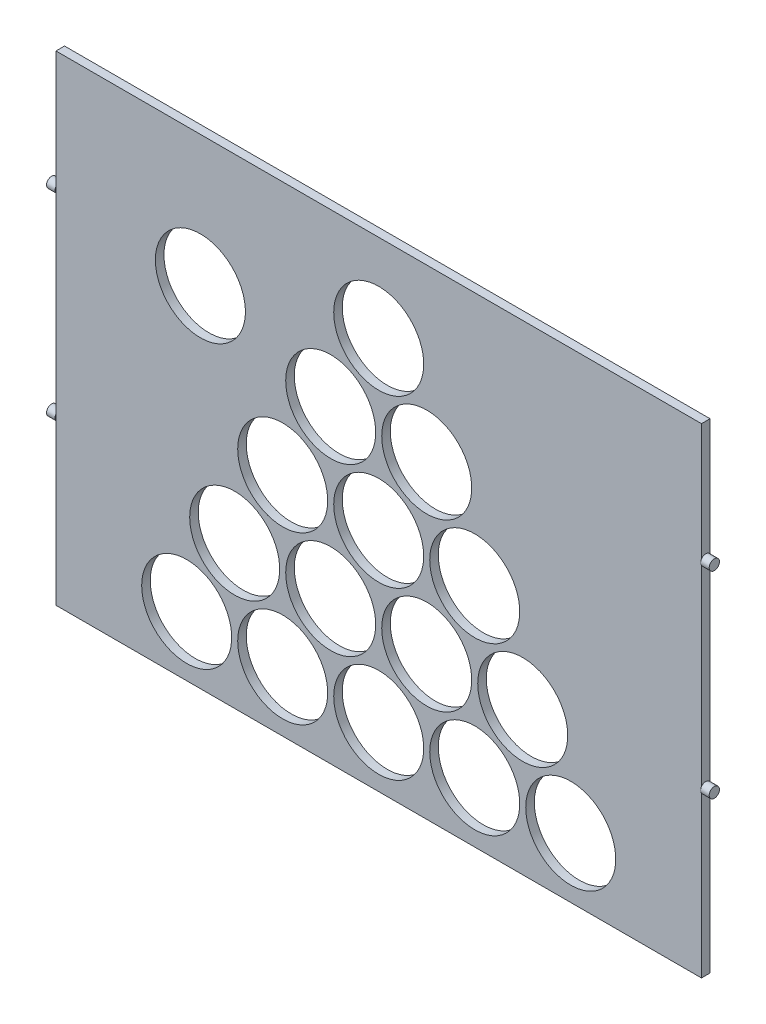
ISO-10303-21;
HEADER;
FILE_DESCRIPTION(('STEP AP214'),'2;1');
FILE_NAME('part.step','',(''),(''),'','','');
FILE_SCHEMA(('AUTOMOTIVE_DESIGN { 1 0 10303 214 1 1 1 1 }'));
ENDSEC;
DATA;
#1=APPLICATION_CONTEXT('core data for automotive mechanical design processes');
#2=APPLICATION_PROTOCOL_DEFINITION('international standard','automotive_design',2000,#1);
#3=PRODUCT_CONTEXT('',#1,'mechanical');
#4=PRODUCT('Part','Part','',(#3));
#5=PRODUCT_RELATED_PRODUCT_CATEGORY('part','',(#4));
#6=PRODUCT_DEFINITION_FORMATION('','',#4);
#7=PRODUCT_DEFINITION_CONTEXT('part definition',#1,'design');
#8=PRODUCT_DEFINITION('design','',#6,#7);
#9=PRODUCT_DEFINITION_SHAPE('','',#8);
#10=(LENGTH_UNIT() NAMED_UNIT(*) SI_UNIT(.MILLI.,.METRE.));
#11=(NAMED_UNIT(*) PLANE_ANGLE_UNIT() SI_UNIT($,.RADIAN.));
#12=(NAMED_UNIT(*) SI_UNIT($,.STERADIAN.) SOLID_ANGLE_UNIT());
#13=UNCERTAINTY_MEASURE_WITH_UNIT(LENGTH_MEASURE(1.E-05),#10,'distance_accuracy_value','');
#14=(GEOMETRIC_REPRESENTATION_CONTEXT(3) GLOBAL_UNCERTAINTY_ASSIGNED_CONTEXT((#13)) GLOBAL_UNIT_ASSIGNED_CONTEXT((#10,
#11,#12)) REPRESENTATION_CONTEXT('',''));
#15=CARTESIAN_POINT('',(0.,0.,0.));
#16=DIRECTION('',(0.,0.,1.));
#17=DIRECTION('',(1.,0.,0.));
#18=AXIS2_PLACEMENT_3D('',#15,#16,#17);
#19=CARTESIAN_POINT('',(376.5,0.,5.));
#20=DIRECTION('',(-1.,0.,0.));
#21=DIRECTION('',(0.,0.,1.));
#22=AXIS2_PLACEMENT_3D('',#19,#20,#21);
#23=PLANE('',#22);
#24=CARTESIAN_POINT('',(376.5,95.,2.49999999999998));
#25=DIRECTION('',(1.,0.,0.));
#26=DIRECTION('',(0.,0.,-1.));
#27=AXIS2_PLACEMENT_3D('',#24,#25,#26);
#28=CIRCLE('',#27,3.);
#29=CARTESIAN_POINT('',(376.5,93.3416876048224,5.));
#30=VERTEX_POINT('',#29);
#31=CARTESIAN_POINT('',(376.5,93.3416876048223,0.));
#32=VERTEX_POINT('',#31);
#33=EDGE_CURVE('E60',#30,#32,#28,.T.);
#34=ORIENTED_EDGE('',*,*,#33,.F.);
#35=DIRECTION('',(0.,1.,0.));
#36=VECTOR('',#35,1.);
#37=CARTESIAN_POINT('',(376.5,0.,5.));
#38=LINE('',#37,#36);
#39=CARTESIAN_POINT('',(376.5,0.,5.));
#40=VERTEX_POINT('',#39);
#41=EDGE_CURVE('E289',#40,#30,#38,.T.);
#42=ORIENTED_EDGE('',*,*,#41,.F.);
#43=DIRECTION('',(0.,0.,-1.));
#44=VECTOR('',#43,1.);
#45=CARTESIAN_POINT('',(376.5,0.,5.));
#46=LINE('',#45,#44);
#47=CARTESIAN_POINT('',(376.5,0.,0.));
#48=VERTEX_POINT('',#47);
#49=EDGE_CURVE('E310',#40,#48,#46,.T.);
#50=ORIENTED_EDGE('',*,*,#49,.T.);
#51=DIRECTION('',(0.,1.,0.));
#52=VECTOR('',#51,1.);
#53=CARTESIAN_POINT('',(376.5,0.,0.));
#54=LINE('',#53,#52);
#55=EDGE_CURVE('E139',#48,#32,#54,.T.);
#56=ORIENTED_EDGE('',*,*,#55,.T.);
#57=EDGE_LOOP('',(#34,#42,#50,#56));
#58=FACE_BOUND('',#57,.T.);
#59=ADVANCED_FACE('F33',(#58),#23,.F.);
#60=CARTESIAN_POINT('',(376.5,210.,2.49999999999999));
#61=DIRECTION('',(1.,0.,0.));
#62=DIRECTION('',(0.,0.,-1.));
#63=AXIS2_PLACEMENT_3D('',#60,#61,#62);
#64=CIRCLE('',#63,3.);
#65=CARTESIAN_POINT('',(376.5,211.658312395178,0.));
#66=VERTEX_POINT('',#65);
#67=CARTESIAN_POINT('',(376.5,211.658312395178,5.));
#68=VERTEX_POINT('',#67);
#69=EDGE_CURVE('E44',#66,#68,#64,.T.);
#70=ORIENTED_EDGE('',*,*,#69,.F.);
#71=CARTESIAN_POINT('',(376.5,280.,0.));
#72=VERTEX_POINT('',#71);
#73=EDGE_CURVE('E153',#66,#72,#54,.T.);
#74=ORIENTED_EDGE('',*,*,#73,.T.);
#75=DIRECTION('',(0.,0.,-1.));
#76=VECTOR('',#75,1.);
#77=CARTESIAN_POINT('',(376.5,280.,5.));
#78=LINE('',#77,#76);
#79=CARTESIAN_POINT('',(376.5,280.,5.));
#80=VERTEX_POINT('',#79);
#81=EDGE_CURVE('E308',#80,#72,#78,.T.);
#82=ORIENTED_EDGE('',*,*,#81,.F.);
#83=EDGE_CURVE('E288',#68,#80,#38,.T.);
#84=ORIENTED_EDGE('',*,*,#83,.F.);
#85=EDGE_LOOP('',(#70,#74,#82,#84));
#86=FACE_BOUND('',#85,.T.);
#87=ADVANCED_FACE('F338',(#86),#23,.F.);
#88=CARTESIAN_POINT('',(0.,0.,5.));
#89=DIRECTION('',(1.,0.,0.));
#90=DIRECTION('',(0.,0.,-1.));
#91=AXIS2_PLACEMENT_3D('',#88,#89,#90);
#92=PLANE('',#91);
#93=CARTESIAN_POINT('',(0.,210.,2.50000000000001));
#94=DIRECTION('',(-1.,0.,0.));
#95=DIRECTION('',(0.,0.,1.));
#96=AXIS2_PLACEMENT_3D('',#93,#94,#95);
#97=CIRCLE('',#96,3.);
#98=CARTESIAN_POINT('',(0.,208.341687604822,0.));
#99=VERTEX_POINT('',#98);
#100=CARTESIAN_POINT('',(0.,208.341687604822,5.));
#101=VERTEX_POINT('',#100);
#102=EDGE_CURVE('E367',#99,#101,#97,.T.);
#103=ORIENTED_EDGE('',*,*,#102,.F.);
#104=DIRECTION('',(0.,-1.,0.));
#105=VECTOR('',#104,1.);
#106=CARTESIAN_POINT('',(0.,0.,0.));
#107=LINE('',#106,#105);
#108=CARTESIAN_POINT('',(0.,96.6583123951777,0.));
#109=VERTEX_POINT('',#108);
#110=EDGE_CURVE('E300',#99,#109,#107,.T.);
#111=ORIENTED_EDGE('',*,*,#110,.T.);
#112=CARTESIAN_POINT('',(0.,95.,2.50000000000002));
#113=DIRECTION('',(-1.,0.,0.));
#114=DIRECTION('',(0.,0.,1.));
#115=AXIS2_PLACEMENT_3D('',#112,#113,#114);
#116=CIRCLE('',#115,3.);
#117=CARTESIAN_POINT('',(0.,96.6583123951777,5.));
#118=VERTEX_POINT('',#117);
#119=EDGE_CURVE('E181',#118,#109,#116,.T.);
#120=ORIENTED_EDGE('',*,*,#119,.F.);
#121=DIRECTION('',(0.,-1.,0.));
#122=VECTOR('',#121,1.);
#123=CARTESIAN_POINT('',(0.,0.,5.));
#124=LINE('',#123,#122);
#125=EDGE_CURVE('E285',#101,#118,#124,.T.);
#126=ORIENTED_EDGE('',*,*,#125,.F.);
#127=EDGE_LOOP('',(#103,#111,#120,#126));
#128=FACE_BOUND('',#127,.T.);
#129=ADVANCED_FACE('F343',(#128),#92,.F.);
#130=CARTESIAN_POINT('',(0.,211.658312395178,5.));
#131=VERTEX_POINT('',#130);
#132=CARTESIAN_POINT('',(0.,211.658312395178,0.));
#133=VERTEX_POINT('',#132);
#134=EDGE_CURVE('E170',#131,#133,#97,.T.);
#135=ORIENTED_EDGE('',*,*,#134,.F.);
#136=CARTESIAN_POINT('',(0.,280.,5.));
#137=VERTEX_POINT('',#136);
#138=EDGE_CURVE('E281',#137,#131,#124,.T.);
#139=ORIENTED_EDGE('',*,*,#138,.F.);
#140=DIRECTION('',(0.,0.,-1.));
#141=VECTOR('',#140,1.);
#142=CARTESIAN_POINT('',(0.,280.,5.));
#143=LINE('',#142,#141);
#144=CARTESIAN_POINT('',(0.,280.,0.));
#145=VERTEX_POINT('',#144);
#146=EDGE_CURVE('E294',#137,#145,#143,.T.);
#147=ORIENTED_EDGE('',*,*,#146,.T.);
#148=EDGE_CURVE('E295',#145,#133,#107,.T.);
#149=ORIENTED_EDGE('',*,*,#148,.T.);
#150=EDGE_LOOP('',(#135,#139,#147,#149));
#151=FACE_BOUND('',#150,.T.);
#152=ADVANCED_FACE('F356',(#151),#92,.F.);
#153=CARTESIAN_POINT('',(0.,93.3416876048224,0.));
#154=VERTEX_POINT('',#153);
#155=CARTESIAN_POINT('',(0.,93.3416876048223,5.));
#156=VERTEX_POINT('',#155);
#157=EDGE_CURVE('E42',#154,#156,#116,.T.);
#158=ORIENTED_EDGE('',*,*,#157,.F.);
#159=CARTESIAN_POINT('',(0.,0.,0.));
#160=VERTEX_POINT('',#159);
#161=EDGE_CURVE('E278',#154,#160,#107,.T.);
#162=ORIENTED_EDGE('',*,*,#161,.T.);
#163=DIRECTION('',(0.,0.,-1.));
#164=VECTOR('',#163,1.);
#165=CARTESIAN_POINT('',(0.,0.,5.));
#166=LINE('',#165,#164);
#167=CARTESIAN_POINT('',(0.,0.,5.));
#168=VERTEX_POINT('',#167);
#169=EDGE_CURVE('E37',#168,#160,#166,.T.);
#170=ORIENTED_EDGE('',*,*,#169,.F.);
#171=EDGE_CURVE('E305',#156,#168,#124,.T.);
#172=ORIENTED_EDGE('',*,*,#171,.F.);
#173=EDGE_LOOP('',(#158,#162,#170,#172));
#174=FACE_BOUND('',#173,.T.);
#175=ADVANCED_FACE('F35',(#174),#92,.F.);
#176=CARTESIAN_POINT('',(0.,0.,5.));
#177=DIRECTION('',(0.,1.,0.));
#178=DIRECTION('',(0.,0.,1.));
#179=AXIS2_PLACEMENT_3D('',#176,#177,#178);
#180=PLANE('',#179);
#181=DIRECTION('',(1.,0.,0.));
#182=VECTOR('',#181,1.);
#183=CARTESIAN_POINT('',(0.,0.,0.));
#184=LINE('',#183,#182);
#185=EDGE_CURVE('E298',#160,#48,#184,.T.);
#186=ORIENTED_EDGE('',*,*,#185,.T.);
#187=ORIENTED_EDGE('',*,*,#49,.F.);
#188=DIRECTION('',(1.,0.,0.));
#189=VECTOR('',#188,1.);
#190=CARTESIAN_POINT('',(0.,0.,5.));
#191=LINE('',#190,#189);
#192=EDGE_CURVE('E284',#168,#40,#191,.T.);
#193=ORIENTED_EDGE('',*,*,#192,.F.);
#194=ORIENTED_EDGE('',*,*,#169,.T.);
#195=EDGE_LOOP('',(#186,#187,#193,#194));
#196=FACE_BOUND('',#195,.T.);
#197=ADVANCED_FACE('F332',(#196),#180,.F.);
#198=CARTESIAN_POINT('',(376.5,96.6583123951777,0.));
#199=VERTEX_POINT('',#198);
#200=CARTESIAN_POINT('',(376.5,96.6583123951777,5.));
#201=VERTEX_POINT('',#200);
#202=EDGE_CURVE('E141',#199,#201,#28,.T.);
#203=ORIENTED_EDGE('',*,*,#202,.F.);
#204=CARTESIAN_POINT('',(376.5,208.341687604822,0.));
#205=VERTEX_POINT('',#204);
#206=EDGE_CURVE('E128',#199,#205,#54,.T.);
#207=ORIENTED_EDGE('',*,*,#206,.T.);
#208=CARTESIAN_POINT('',(376.5,208.341687604822,5.));
#209=VERTEX_POINT('',#208);
#210=EDGE_CURVE('E11',#209,#205,#64,.T.);
#211=ORIENTED_EDGE('',*,*,#210,.F.);
#212=EDGE_CURVE('E52',#201,#209,#38,.T.);
#213=ORIENTED_EDGE('',*,*,#212,.F.);
#214=EDGE_LOOP('',(#203,#207,#211,#213));
#215=FACE_BOUND('',#214,.T.);
#216=ADVANCED_FACE('F142',(#215),#23,.F.);
#217=CARTESIAN_POINT('',(0.,280.,5.));
#218=DIRECTION('',(0.,-1.,0.));
#219=DIRECTION('',(0.,0.,-1.));
#220=AXIS2_PLACEMENT_3D('',#217,#218,#219);
#221=PLANE('',#220);
#222=DIRECTION('',(-1.,0.,0.));
#223=VECTOR('',#222,1.);
#224=CARTESIAN_POINT('',(0.,280.,0.));
#225=LINE('',#224,#223);
#226=EDGE_CURVE('E303',#72,#145,#225,.T.);
#227=ORIENTED_EDGE('',*,*,#226,.T.);
#228=ORIENTED_EDGE('',*,*,#146,.F.);
#229=DIRECTION('',(-1.,0.,0.));
#230=VECTOR('',#229,1.);
#231=CARTESIAN_POINT('',(0.,280.,5.));
#232=LINE('',#231,#230);
#233=EDGE_CURVE('E291',#80,#137,#232,.T.);
#234=ORIENTED_EDGE('',*,*,#233,.F.);
#235=ORIENTED_EDGE('',*,*,#81,.T.);
#236=EDGE_LOOP('',(#227,#228,#234,#235));
#237=FACE_BOUND('',#236,.T.);
#238=ADVANCED_FACE('F347',(#237),#221,.F.);
#239=CARTESIAN_POINT('',(0.,0.,5.));
#240=DIRECTION('',(0.,0.,-1.));
#241=DIRECTION('',(-1.,0.,0.));
#242=AXIS2_PLACEMENT_3D('',#239,#240,#241);
#243=PLANE('',#242);
#244=CARTESIAN_POINT('',(132.25,131.994845223857,5.));
#245=DIRECTION('',(0.,0.,1.));
#246=DIRECTION('',(-1.,0.,0.));
#247=AXIS2_PLACEMENT_3D('',#244,#245,#246);
#248=CIRCLE('',#247,26.25);
#249=CARTESIAN_POINT('',(106.,131.994845223857,5.));
#250=VERTEX_POINT('',#249);
#251=EDGE_CURVE('E243',#250,#250,#248,.T.);
#252=ORIENTED_EDGE('',*,*,#251,.F.);
#253=EDGE_LOOP('',(#252));
#254=FACE_BOUND('',#253,.T.);
#255=CARTESIAN_POINT('',(188.25,131.994845223857,5.));
#256=DIRECTION('',(0.,0.,1.));
#257=DIRECTION('',(-1.,0.,0.));
#258=AXIS2_PLACEMENT_3D('',#255,#256,#257);
#259=CIRCLE('',#258,26.2500000000001);
#260=CARTESIAN_POINT('',(162.,131.994845223857,5.));
#261=VERTEX_POINT('',#260);
#262=EDGE_CURVE('E230',#261,#261,#259,.T.);
#263=ORIENTED_EDGE('',*,*,#262,.F.);
#264=EDGE_LOOP('',(#263));
#265=FACE_BOUND('',#264,.T.);
#266=CARTESIAN_POINT('',(272.25,83.4974226119274,5.));
#267=DIRECTION('',(0.,0.,1.));
#268=DIRECTION('',(-1.,0.,0.));
#269=AXIS2_PLACEMENT_3D('',#266,#267,#268);
#270=CIRCLE('',#269,26.2499999999999);
#271=CARTESIAN_POINT('',(246.,83.4974226119274,5.));
#272=VERTEX_POINT('',#271);
#273=EDGE_CURVE('E231',#272,#272,#270,.T.);
#274=ORIENTED_EDGE('',*,*,#273,.F.);
#275=EDGE_LOOP('',(#274));
#276=FACE_BOUND('',#275,.T.);
#277=CARTESIAN_POINT('',(216.25,83.4974226119278,5.));
#278=DIRECTION('',(0.,0.,1.));
#279=DIRECTION('',(-1.,0.,0.));
#280=AXIS2_PLACEMENT_3D('',#277,#278,#279);
#281=CIRCLE('',#280,26.2500000000001);
#282=CARTESIAN_POINT('',(190.,83.4974226119278,5.));
#283=VERTEX_POINT('',#282);
#284=EDGE_CURVE('E206',#283,#283,#281,.T.);
#285=ORIENTED_EDGE('',*,*,#284,.F.);
#286=EDGE_LOOP('',(#285));
#287=FACE_BOUND('',#286,.T.);
#288=CARTESIAN_POINT('',(160.25,180.492267835786,5.));
#289=DIRECTION('',(0.,0.,1.));
#290=DIRECTION('',(-1.,0.,0.));
#291=AXIS2_PLACEMENT_3D('',#288,#289,#290);
#292=CIRCLE('',#291,26.2500000000001);
#293=CARTESIAN_POINT('',(134.,180.492267835786,5.));
#294=VERTEX_POINT('',#293);
#295=EDGE_CURVE('E260',#294,#294,#292,.T.);
#296=ORIENTED_EDGE('',*,*,#295,.F.);
#297=EDGE_LOOP('',(#296));
#298=FACE_BOUND('',#297,.T.);
#299=CARTESIAN_POINT('',(188.25,228.989690447714,5.));
#300=DIRECTION('',(0.,0.,1.));
#301=DIRECTION('',(-1.,0.,0.));
#302=AXIS2_PLACEMENT_3D('',#299,#300,#301);
#303=CIRCLE('',#302,26.2500000000001);
#304=CARTESIAN_POINT('',(162.,228.989690447714,5.));
#305=VERTEX_POINT('',#304);
#306=EDGE_CURVE('E266',#305,#305,#303,.T.);
#307=ORIENTED_EDGE('',*,*,#306,.F.);
#308=EDGE_LOOP('',(#307));
#309=FACE_BOUND('',#308,.T.);
#310=CARTESIAN_POINT('',(244.25,131.994845223856,5.));
#311=DIRECTION('',(0.,0.,1.));
#312=DIRECTION('',(-1.,0.,0.));
#313=AXIS2_PLACEMENT_3D('',#310,#311,#312);
#314=CIRCLE('',#313,26.25);
#315=CARTESIAN_POINT('',(218.,131.994845223856,5.));
#316=VERTEX_POINT('',#315);
#317=EDGE_CURVE('E242',#316,#316,#314,.T.);
#318=ORIENTED_EDGE('',*,*,#317,.F.);
#319=EDGE_LOOP('',(#318));
#320=FACE_BOUND('',#319,.T.);
#321=CARTESIAN_POINT('',(216.25,180.492267835785,5.));
#322=DIRECTION('',(0.,0.,1.));
#323=DIRECTION('',(-1.,0.,0.));
#324=AXIS2_PLACEMENT_3D('',#321,#322,#323);
#325=CIRCLE('',#324,26.25);
#326=CARTESIAN_POINT('',(190.,180.492267835785,5.));
#327=VERTEX_POINT('',#326);
#328=EDGE_CURVE('E254',#327,#327,#325,.T.);
#329=ORIENTED_EDGE('',*,*,#328,.F.);
#330=EDGE_LOOP('',(#329));
#331=FACE_BOUND('',#330,.T.);
#332=CARTESIAN_POINT('',(76.25,35.,5.));
#333=DIRECTION('',(0.,0.,1.));
#334=DIRECTION('',(-1.,0.,0.));
#335=AXIS2_PLACEMENT_3D('',#332,#333,#334);
#336=CIRCLE('',#335,26.25);
#337=CARTESIAN_POINT('',(50.,35.,5.));
#338=VERTEX_POINT('',#337);
#339=EDGE_CURVE('E180',#338,#338,#336,.T.);
#340=ORIENTED_EDGE('',*,*,#339,.F.);
#341=EDGE_LOOP('',(#340));
#342=FACE_BOUND('',#341,.T.);
#343=CARTESIAN_POINT('',(132.25,34.9999999999996,5.));
#344=DIRECTION('',(0.,0.,1.));
#345=DIRECTION('',(-1.,0.,0.));
#346=AXIS2_PLACEMENT_3D('',#343,#344,#345);
#347=CIRCLE('',#346,26.2500000000001);
#348=CARTESIAN_POINT('',(106.,34.9999999999996,5.));
#349=VERTEX_POINT('',#348);
#350=EDGE_CURVE('E195',#349,#349,#347,.T.);
#351=ORIENTED_EDGE('',*,*,#350,.F.);
#352=EDGE_LOOP('',(#351));
#353=FACE_BOUND('',#352,.T.);
#354=CARTESIAN_POINT('',(188.25,34.9999999999992,5.));
#355=DIRECTION('',(0.,0.,1.));
#356=DIRECTION('',(-1.,0.,0.));
#357=AXIS2_PLACEMENT_3D('',#354,#355,#356);
#358=CIRCLE('',#357,26.25);
#359=CARTESIAN_POINT('',(162.,34.9999999999992,5.));
#360=VERTEX_POINT('',#359);
#361=EDGE_CURVE('E189',#360,#360,#358,.T.);
#362=ORIENTED_EDGE('',*,*,#361,.F.);
#363=EDGE_LOOP('',(#362));
#364=FACE_BOUND('',#363,.T.);
#365=CARTESIAN_POINT('',(244.25,34.9999999999988,5.));
#366=DIRECTION('',(0.,0.,1.));
#367=DIRECTION('',(-1.,0.,0.));
#368=AXIS2_PLACEMENT_3D('',#365,#366,#367);
#369=CIRCLE('',#368,26.25);
#370=CARTESIAN_POINT('',(218.,34.9999999999988,5.));
#371=VERTEX_POINT('',#370);
#372=EDGE_CURVE('E188',#371,#371,#369,.T.);
#373=ORIENTED_EDGE('',*,*,#372,.F.);
#374=EDGE_LOOP('',(#373));
#375=FACE_BOUND('',#374,.T.);
#376=CARTESIAN_POINT('',(300.25,34.9999999999985,5.));
#377=DIRECTION('',(0.,0.,1.));
#378=DIRECTION('',(-1.,0.,0.));
#379=AXIS2_PLACEMENT_3D('',#376,#377,#378);
#380=CIRCLE('',#379,26.25);
#381=CARTESIAN_POINT('',(274.,34.9999999999985,5.));
#382=VERTEX_POINT('',#381);
#383=EDGE_CURVE('E219',#382,#382,#380,.T.);
#384=ORIENTED_EDGE('',*,*,#383,.F.);
#385=EDGE_LOOP('',(#384));
#386=FACE_BOUND('',#385,.T.);
#387=CARTESIAN_POINT('',(160.25,83.4974226119282,5.));
#388=DIRECTION('',(0.,0.,1.));
#389=DIRECTION('',(-1.,0.,0.));
#390=AXIS2_PLACEMENT_3D('',#387,#388,#389);
#391=CIRCLE('',#390,26.25);
#392=CARTESIAN_POINT('',(134.,83.4974226119282,5.));
#393=VERTEX_POINT('',#392);
#394=EDGE_CURVE('E213',#393,#393,#391,.T.);
#395=ORIENTED_EDGE('',*,*,#394,.F.);
#396=EDGE_LOOP('',(#395));
#397=FACE_BOUND('',#396,.T.);
#398=CARTESIAN_POINT('',(104.25,83.4974226119286,5.));
#399=DIRECTION('',(0.,0.,1.));
#400=DIRECTION('',(-1.,0.,0.));
#401=AXIS2_PLACEMENT_3D('',#398,#399,#400);
#402=CIRCLE('',#401,26.2500000000001);
#403=CARTESIAN_POINT('',(77.9999999999999,83.4974226119286,5.));
#404=VERTEX_POINT('',#403);
#405=EDGE_CURVE('E207',#404,#404,#402,.T.);
#406=ORIENTED_EDGE('',*,*,#405,.F.);
#407=EDGE_LOOP('',(#406));
#408=FACE_BOUND('',#407,.T.);
#409=CARTESIAN_POINT('',(84.25,203.497422611929,5.));
#410=DIRECTION('',(0.,0.,1.));
#411=DIRECTION('',(-1.,0.,0.));
#412=AXIS2_PLACEMENT_3D('',#409,#410,#411);
#413=CIRCLE('',#412,26.2500000000001);
#414=CARTESIAN_POINT('',(57.9999999999999,203.497422611929,5.));
#415=VERTEX_POINT('',#414);
#416=EDGE_CURVE('E272',#415,#415,#413,.T.);
#417=ORIENTED_EDGE('',*,*,#416,.F.);
#418=EDGE_LOOP('',(#417));
#419=FACE_BOUND('',#418,.T.);
#420=ORIENTED_EDGE('',*,*,#138,.T.);
#421=DIRECTION('',(0.,1.,0.));
#422=VECTOR('',#421,1.);
#423=CARTESIAN_POINT('',(0.,0.,5.));
#424=LINE('',#423,#422);
#425=EDGE_CURVE('E169',#101,#131,#424,.T.);
#426=ORIENTED_EDGE('',*,*,#425,.F.);
#427=ORIENTED_EDGE('',*,*,#125,.T.);
#428=EDGE_CURVE('E286',#118,#156,#124,.T.);
#429=ORIENTED_EDGE('',*,*,#428,.T.);
#430=ORIENTED_EDGE('',*,*,#171,.T.);
#431=ORIENTED_EDGE('',*,*,#192,.T.);
#432=ORIENTED_EDGE('',*,*,#41,.T.);
#433=DIRECTION('',(0.,-1.,0.));
#434=VECTOR('',#433,1.);
#435=CARTESIAN_POINT('',(376.5,0.,5.));
#436=LINE('',#435,#434);
#437=EDGE_CURVE('E157',#201,#30,#436,.T.);
#438=ORIENTED_EDGE('',*,*,#437,.F.);
#439=ORIENTED_EDGE('',*,*,#212,.T.);
#440=EDGE_CURVE('E292',#209,#68,#38,.T.);
#441=ORIENTED_EDGE('',*,*,#440,.T.);
#442=ORIENTED_EDGE('',*,*,#83,.T.);
#443=ORIENTED_EDGE('',*,*,#233,.T.);
#444=EDGE_LOOP('',(#420,#426,#427,#429,#430,#431,#432,#438,#439,#441,#442,#443));
#445=FACE_BOUND('',#444,.T.);
#446=ADVANCED_FACE('F330',(#254,#265,#276,#287,#298,#309,#320,#331,#342,#353,#364,#375,#386,
#397,#408,#419,#445),#243,.F.);
#447=CARTESIAN_POINT('',(0.,0.,0.));
#448=DIRECTION('',(0.,0.,-1.));
#449=DIRECTION('',(-1.,0.,0.));
#450=AXIS2_PLACEMENT_3D('',#447,#448,#449);
#451=PLANE('',#450);
#452=CARTESIAN_POINT('',(132.25,131.994845223857,0.));
#453=DIRECTION('',(0.,0.,1.));
#454=DIRECTION('',(-1.,0.,0.));
#455=AXIS2_PLACEMENT_3D('',#452,#453,#454);
#456=CIRCLE('',#455,26.25);
#457=CARTESIAN_POINT('',(106.,131.994845223857,0.));
#458=VERTEX_POINT('',#457);
#459=EDGE_CURVE('E239',#458,#458,#456,.T.);
#460=ORIENTED_EDGE('',*,*,#459,.T.);
#461=EDGE_LOOP('',(#460));
#462=FACE_BOUND('',#461,.T.);
#463=CARTESIAN_POINT('',(188.25,131.994845223857,0.));
#464=DIRECTION('',(0.,0.,1.));
#465=DIRECTION('',(-1.,0.,0.));
#466=AXIS2_PLACEMENT_3D('',#463,#464,#465);
#467=CIRCLE('',#466,26.2500000000001);
#468=CARTESIAN_POINT('',(162.,131.994845223857,0.));
#469=VERTEX_POINT('',#468);
#470=EDGE_CURVE('E246',#469,#469,#467,.T.);
#471=ORIENTED_EDGE('',*,*,#470,.T.);
#472=EDGE_LOOP('',(#471));
#473=FACE_BOUND('',#472,.T.);
#474=CARTESIAN_POINT('',(272.25,83.4974226119274,0.));
#475=DIRECTION('',(0.,0.,1.));
#476=DIRECTION('',(-1.,0.,0.));
#477=AXIS2_PLACEMENT_3D('',#474,#475,#476);
#478=CIRCLE('',#477,26.2499999999999);
#479=CARTESIAN_POINT('',(246.,83.4974226119274,0.));
#480=VERTEX_POINT('',#479);
#481=EDGE_CURVE('E227',#480,#480,#478,.T.);
#482=ORIENTED_EDGE('',*,*,#481,.T.);
#483=EDGE_LOOP('',(#482));
#484=FACE_BOUND('',#483,.T.);
#485=CARTESIAN_POINT('',(216.25,83.4974226119278,0.));
#486=DIRECTION('',(0.,0.,1.));
#487=DIRECTION('',(-1.,0.,0.));
#488=AXIS2_PLACEMENT_3D('',#485,#486,#487);
#489=CIRCLE('',#488,26.2500000000001);
#490=CARTESIAN_POINT('',(190.,83.4974226119278,0.));
#491=VERTEX_POINT('',#490);
#492=EDGE_CURVE('E234',#491,#491,#489,.T.);
#493=ORIENTED_EDGE('',*,*,#492,.T.);
#494=EDGE_LOOP('',(#493));
#495=FACE_BOUND('',#494,.T.);
#496=CARTESIAN_POINT('',(160.25,180.492267835786,0.));
#497=DIRECTION('',(0.,0.,1.));
#498=DIRECTION('',(-1.,0.,0.));
#499=AXIS2_PLACEMENT_3D('',#496,#497,#498);
#500=CIRCLE('',#499,26.2500000000001);
#501=CARTESIAN_POINT('',(134.,180.492267835786,0.));
#502=VERTEX_POINT('',#501);
#503=EDGE_CURVE('E263',#502,#502,#500,.T.);
#504=ORIENTED_EDGE('',*,*,#503,.T.);
#505=EDGE_LOOP('',(#504));
#506=FACE_BOUND('',#505,.T.);
#507=CARTESIAN_POINT('',(188.25,228.989690447714,0.));
#508=DIRECTION('',(0.,0.,1.));
#509=DIRECTION('',(-1.,0.,0.));
#510=AXIS2_PLACEMENT_3D('',#507,#508,#509);
#511=CIRCLE('',#510,26.2500000000001);
#512=CARTESIAN_POINT('',(162.,228.989690447714,0.));
#513=VERTEX_POINT('',#512);
#514=EDGE_CURVE('E269',#513,#513,#511,.T.);
#515=ORIENTED_EDGE('',*,*,#514,.T.);
#516=EDGE_LOOP('',(#515));
#517=FACE_BOUND('',#516,.T.);
#518=CARTESIAN_POINT('',(244.25,131.994845223856,0.));
#519=DIRECTION('',(0.,0.,1.));
#520=DIRECTION('',(-1.,0.,0.));
#521=AXIS2_PLACEMENT_3D('',#518,#519,#520);
#522=CIRCLE('',#521,26.25);
#523=CARTESIAN_POINT('',(218.,131.994845223856,0.));
#524=VERTEX_POINT('',#523);
#525=EDGE_CURVE('E251',#524,#524,#522,.T.);
#526=ORIENTED_EDGE('',*,*,#525,.T.);
#527=EDGE_LOOP('',(#526));
#528=FACE_BOUND('',#527,.T.);
#529=CARTESIAN_POINT('',(216.25,180.492267835785,0.));
#530=DIRECTION('',(0.,0.,1.));
#531=DIRECTION('',(-1.,0.,0.));
#532=AXIS2_PLACEMENT_3D('',#529,#530,#531);
#533=CIRCLE('',#532,26.25);
#534=CARTESIAN_POINT('',(190.,180.492267835785,0.));
#535=VERTEX_POINT('',#534);
#536=EDGE_CURVE('E257',#535,#535,#533,.T.);
#537=ORIENTED_EDGE('',*,*,#536,.T.);
#538=EDGE_LOOP('',(#537));
#539=FACE_BOUND('',#538,.T.);
#540=CARTESIAN_POINT('',(76.25,35.,0.));
#541=DIRECTION('',(0.,0.,1.));
#542=DIRECTION('',(-1.,0.,0.));
#543=AXIS2_PLACEMENT_3D('',#540,#541,#542);
#544=CIRCLE('',#543,26.25);
#545=CARTESIAN_POINT('',(50.,35.,0.));
#546=VERTEX_POINT('',#545);
#547=EDGE_CURVE('E198',#546,#546,#544,.T.);
#548=ORIENTED_EDGE('',*,*,#547,.T.);
#549=EDGE_LOOP('',(#548));
#550=FACE_BOUND('',#549,.T.);
#551=CARTESIAN_POINT('',(132.25,34.9999999999996,0.));
#552=DIRECTION('',(0.,0.,1.));
#553=DIRECTION('',(-1.,0.,0.));
#554=AXIS2_PLACEMENT_3D('',#551,#552,#553);
#555=CIRCLE('',#554,26.2500000000001);
#556=CARTESIAN_POINT('',(106.,34.9999999999996,0.));
#557=VERTEX_POINT('',#556);
#558=EDGE_CURVE('E192',#557,#557,#555,.T.);
#559=ORIENTED_EDGE('',*,*,#558,.T.);
#560=EDGE_LOOP('',(#559));
#561=FACE_BOUND('',#560,.T.);
#562=CARTESIAN_POINT('',(188.25,34.9999999999992,0.));
#563=DIRECTION('',(0.,0.,1.));
#564=DIRECTION('',(-1.,0.,0.));
#565=AXIS2_PLACEMENT_3D('',#562,#563,#564);
#566=CIRCLE('',#565,26.25);
#567=CARTESIAN_POINT('',(162.,34.9999999999992,0.));
#568=VERTEX_POINT('',#567);
#569=EDGE_CURVE('E185',#568,#568,#566,.T.);
#570=ORIENTED_EDGE('',*,*,#569,.T.);
#571=EDGE_LOOP('',(#570));
#572=FACE_BOUND('',#571,.T.);
#573=CARTESIAN_POINT('',(244.25,34.9999999999988,0.));
#574=DIRECTION('',(0.,0.,1.));
#575=DIRECTION('',(-1.,0.,0.));
#576=AXIS2_PLACEMENT_3D('',#573,#574,#575);
#577=CIRCLE('',#576,26.25);
#578=CARTESIAN_POINT('',(218.,34.9999999999988,0.));
#579=VERTEX_POINT('',#578);
#580=EDGE_CURVE('E222',#579,#579,#577,.T.);
#581=ORIENTED_EDGE('',*,*,#580,.T.);
#582=EDGE_LOOP('',(#581));
#583=FACE_BOUND('',#582,.T.);
#584=CARTESIAN_POINT('',(300.25,34.9999999999985,0.));
#585=DIRECTION('',(0.,0.,1.));
#586=DIRECTION('',(-1.,0.,0.));
#587=AXIS2_PLACEMENT_3D('',#584,#585,#586);
#588=CIRCLE('',#587,26.25);
#589=CARTESIAN_POINT('',(274.,34.9999999999985,0.));
#590=VERTEX_POINT('',#589);
#591=EDGE_CURVE('E216',#590,#590,#588,.T.);
#592=ORIENTED_EDGE('',*,*,#591,.T.);
#593=EDGE_LOOP('',(#592));
#594=FACE_BOUND('',#593,.T.);
#595=CARTESIAN_POINT('',(160.25,83.4974226119282,0.));
#596=DIRECTION('',(0.,0.,1.));
#597=DIRECTION('',(-1.,0.,0.));
#598=AXIS2_PLACEMENT_3D('',#595,#596,#597);
#599=CIRCLE('',#598,26.25);
#600=CARTESIAN_POINT('',(134.,83.4974226119282,0.));
#601=VERTEX_POINT('',#600);
#602=EDGE_CURVE('E210',#601,#601,#599,.T.);
#603=ORIENTED_EDGE('',*,*,#602,.T.);
#604=EDGE_LOOP('',(#603));
#605=FACE_BOUND('',#604,.T.);
#606=CARTESIAN_POINT('',(104.25,83.4974226119286,0.));
#607=DIRECTION('',(0.,0.,1.));
#608=DIRECTION('',(-1.,0.,0.));
#609=AXIS2_PLACEMENT_3D('',#606,#607,#608);
#610=CIRCLE('',#609,26.2500000000001);
#611=CARTESIAN_POINT('',(77.9999999999999,83.4974226119286,0.));
#612=VERTEX_POINT('',#611);
#613=EDGE_CURVE('E203',#612,#612,#610,.T.);
#614=ORIENTED_EDGE('',*,*,#613,.T.);
#615=EDGE_LOOP('',(#614));
#616=FACE_BOUND('',#615,.T.);
#617=CARTESIAN_POINT('',(84.25,203.497422611929,0.));
#618=DIRECTION('',(0.,0.,1.));
#619=DIRECTION('',(-1.,0.,0.));
#620=AXIS2_PLACEMENT_3D('',#617,#618,#619);
#621=CIRCLE('',#620,26.2500000000001);
#622=CARTESIAN_POINT('',(57.9999999999999,203.497422611929,0.));
#623=VERTEX_POINT('',#622);
#624=EDGE_CURVE('E275',#623,#623,#621,.T.);
#625=ORIENTED_EDGE('',*,*,#624,.T.);
#626=EDGE_LOOP('',(#625));
#627=FACE_BOUND('',#626,.T.);
#628=ORIENTED_EDGE('',*,*,#148,.F.);
#629=ORIENTED_EDGE('',*,*,#226,.F.);
#630=ORIENTED_EDGE('',*,*,#73,.F.);
#631=EDGE_CURVE('E136',#205,#66,#54,.T.);
#632=ORIENTED_EDGE('',*,*,#631,.F.);
#633=ORIENTED_EDGE('',*,*,#206,.F.);
#634=EDGE_CURVE('E133',#32,#199,#54,.T.);
#635=ORIENTED_EDGE('',*,*,#634,.F.);
#636=ORIENTED_EDGE('',*,*,#55,.F.);
#637=ORIENTED_EDGE('',*,*,#185,.F.);
#638=ORIENTED_EDGE('',*,*,#161,.F.);
#639=EDGE_CURVE('E301',#109,#154,#107,.T.);
#640=ORIENTED_EDGE('',*,*,#639,.F.);
#641=ORIENTED_EDGE('',*,*,#110,.F.);
#642=EDGE_CURVE('E299',#133,#99,#107,.T.);
#643=ORIENTED_EDGE('',*,*,#642,.F.);
#644=EDGE_LOOP('',(#628,#629,#630,#632,#633,#635,#636,#637,#638,#640,#641,#643));
#645=FACE_BOUND('',#644,.T.);
#646=ADVANCED_FACE('F130',(#462,#473,#484,#495,#506,#517,#528,#539,#550,#561,#572,#583,#594,
#605,#616,#627,#645),#451,.T.);
#647=CARTESIAN_POINT('',(84.25,203.497422611929,0.));
#648=DIRECTION('',(0.,0.,1.));
#649=DIRECTION('',(1.,0.,0.));
#650=AXIS2_PLACEMENT_3D('',#647,#648,#649);
#651=CYLINDRICAL_SURFACE('',#650,26.2500000000001);
#652=ORIENTED_EDGE('',*,*,#624,.F.);
#653=EDGE_LOOP('',(#652));
#654=FACE_BOUND('',#653,.T.);
#655=ORIENTED_EDGE('',*,*,#416,.T.);
#656=EDGE_LOOP('',(#655));
#657=FACE_BOUND('',#656,.T.);
#658=ADVANCED_FACE('F672',(#654,#657),#651,.F.);
#659=CARTESIAN_POINT('',(104.25,83.4974226119286,0.));
#660=DIRECTION('',(0.,0.,1.));
#661=DIRECTION('',(1.,0.,0.));
#662=AXIS2_PLACEMENT_3D('',#659,#660,#661);
#663=CYLINDRICAL_SURFACE('',#662,26.2500000000001);
#664=ORIENTED_EDGE('',*,*,#613,.F.);
#665=EDGE_LOOP('',(#664));
#666=FACE_BOUND('',#665,.T.);
#667=ORIENTED_EDGE('',*,*,#405,.T.);
#668=EDGE_LOOP('',(#667));
#669=FACE_BOUND('',#668,.T.);
#670=ADVANCED_FACE('F663',(#666,#669),#663,.F.);
#671=CARTESIAN_POINT('',(160.25,83.4974226119282,0.));
#672=DIRECTION('',(0.,0.,1.));
#673=DIRECTION('',(1.,0.,0.));
#674=AXIS2_PLACEMENT_3D('',#671,#672,#673);
#675=CYLINDRICAL_SURFACE('',#674,26.25);
#676=ORIENTED_EDGE('',*,*,#602,.F.);
#677=EDGE_LOOP('',(#676));
#678=FACE_BOUND('',#677,.T.);
#679=ORIENTED_EDGE('',*,*,#394,.T.);
#680=EDGE_LOOP('',(#679));
#681=FACE_BOUND('',#680,.T.);
#682=ADVANCED_FACE('F654',(#678,#681),#675,.F.);
#683=CARTESIAN_POINT('',(300.25,34.9999999999985,0.));
#684=DIRECTION('',(0.,0.,1.));
#685=DIRECTION('',(1.,0.,0.));
#686=AXIS2_PLACEMENT_3D('',#683,#684,#685);
#687=CYLINDRICAL_SURFACE('',#686,26.25);
#688=ORIENTED_EDGE('',*,*,#591,.F.);
#689=EDGE_LOOP('',(#688));
#690=FACE_BOUND('',#689,.T.);
#691=ORIENTED_EDGE('',*,*,#383,.T.);
#692=EDGE_LOOP('',(#691));
#693=FACE_BOUND('',#692,.T.);
#694=ADVANCED_FACE('F645',(#690,#693),#687,.F.);
#695=CARTESIAN_POINT('',(244.25,34.9999999999988,0.));
#696=DIRECTION('',(0.,0.,1.));
#697=DIRECTION('',(1.,0.,0.));
#698=AXIS2_PLACEMENT_3D('',#695,#696,#697);
#699=CYLINDRICAL_SURFACE('',#698,26.25);
#700=ORIENTED_EDGE('',*,*,#580,.F.);
#701=EDGE_LOOP('',(#700));
#702=FACE_BOUND('',#701,.T.);
#703=ORIENTED_EDGE('',*,*,#372,.T.);
#704=EDGE_LOOP('',(#703));
#705=FACE_BOUND('',#704,.T.);
#706=ADVANCED_FACE('F636',(#702,#705),#699,.F.);
#707=CARTESIAN_POINT('',(188.25,34.9999999999992,0.));
#708=DIRECTION('',(0.,0.,1.));
#709=DIRECTION('',(1.,0.,0.));
#710=AXIS2_PLACEMENT_3D('',#707,#708,#709);
#711=CYLINDRICAL_SURFACE('',#710,26.25);
#712=ORIENTED_EDGE('',*,*,#569,.F.);
#713=EDGE_LOOP('',(#712));
#714=FACE_BOUND('',#713,.T.);
#715=ORIENTED_EDGE('',*,*,#361,.T.);
#716=EDGE_LOOP('',(#715));
#717=FACE_BOUND('',#716,.T.);
#718=ADVANCED_FACE('F627',(#714,#717),#711,.F.);
#719=CARTESIAN_POINT('',(132.25,34.9999999999996,0.));
#720=DIRECTION('',(0.,0.,1.));
#721=DIRECTION('',(1.,0.,0.));
#722=AXIS2_PLACEMENT_3D('',#719,#720,#721);
#723=CYLINDRICAL_SURFACE('',#722,26.2500000000001);
#724=ORIENTED_EDGE('',*,*,#558,.F.);
#725=EDGE_LOOP('',(#724));
#726=FACE_BOUND('',#725,.T.);
#727=ORIENTED_EDGE('',*,*,#350,.T.);
#728=EDGE_LOOP('',(#727));
#729=FACE_BOUND('',#728,.T.);
#730=ADVANCED_FACE('F618',(#726,#729),#723,.F.);
#731=CARTESIAN_POINT('',(76.25,35.,0.));
#732=DIRECTION('',(0.,0.,1.));
#733=DIRECTION('',(1.,0.,0.));
#734=AXIS2_PLACEMENT_3D('',#731,#732,#733);
#735=CYLINDRICAL_SURFACE('',#734,26.25);
#736=ORIENTED_EDGE('',*,*,#547,.F.);
#737=EDGE_LOOP('',(#736));
#738=FACE_BOUND('',#737,.T.);
#739=ORIENTED_EDGE('',*,*,#339,.T.);
#740=EDGE_LOOP('',(#739));
#741=FACE_BOUND('',#740,.T.);
#742=ADVANCED_FACE('F609',(#738,#741),#735,.F.);
#743=CARTESIAN_POINT('',(216.25,180.492267835785,0.));
#744=DIRECTION('',(0.,0.,1.));
#745=DIRECTION('',(1.,0.,0.));
#746=AXIS2_PLACEMENT_3D('',#743,#744,#745);
#747=CYLINDRICAL_SURFACE('',#746,26.25);
#748=ORIENTED_EDGE('',*,*,#536,.F.);
#749=EDGE_LOOP('',(#748));
#750=FACE_BOUND('',#749,.T.);
#751=ORIENTED_EDGE('',*,*,#328,.T.);
#752=EDGE_LOOP('',(#751));
#753=FACE_BOUND('',#752,.T.);
#754=ADVANCED_FACE('F600',(#750,#753),#747,.F.);
#755=CARTESIAN_POINT('',(244.25,131.994845223856,0.));
#756=DIRECTION('',(0.,0.,1.));
#757=DIRECTION('',(1.,0.,0.));
#758=AXIS2_PLACEMENT_3D('',#755,#756,#757);
#759=CYLINDRICAL_SURFACE('',#758,26.25);
#760=ORIENTED_EDGE('',*,*,#525,.F.);
#761=EDGE_LOOP('',(#760));
#762=FACE_BOUND('',#761,.T.);
#763=ORIENTED_EDGE('',*,*,#317,.T.);
#764=EDGE_LOOP('',(#763));
#765=FACE_BOUND('',#764,.T.);
#766=ADVANCED_FACE('F591',(#762,#765),#759,.F.);
#767=CARTESIAN_POINT('',(188.25,228.989690447714,0.));
#768=DIRECTION('',(0.,0.,1.));
#769=DIRECTION('',(1.,0.,0.));
#770=AXIS2_PLACEMENT_3D('',#767,#768,#769);
#771=CYLINDRICAL_SURFACE('',#770,26.2500000000001);
#772=ORIENTED_EDGE('',*,*,#514,.F.);
#773=EDGE_LOOP('',(#772));
#774=FACE_BOUND('',#773,.T.);
#775=ORIENTED_EDGE('',*,*,#306,.T.);
#776=EDGE_LOOP('',(#775));
#777=FACE_BOUND('',#776,.T.);
#778=ADVANCED_FACE('F582',(#774,#777),#771,.F.);
#779=CARTESIAN_POINT('',(160.25,180.492267835786,0.));
#780=DIRECTION('',(0.,0.,1.));
#781=DIRECTION('',(1.,0.,0.));
#782=AXIS2_PLACEMENT_3D('',#779,#780,#781);
#783=CYLINDRICAL_SURFACE('',#782,26.2500000000001);
#784=ORIENTED_EDGE('',*,*,#503,.F.);
#785=EDGE_LOOP('',(#784));
#786=FACE_BOUND('',#785,.T.);
#787=ORIENTED_EDGE('',*,*,#295,.T.);
#788=EDGE_LOOP('',(#787));
#789=FACE_BOUND('',#788,.T.);
#790=ADVANCED_FACE('F573',(#786,#789),#783,.F.);
#791=CARTESIAN_POINT('',(216.25,83.4974226119278,0.));
#792=DIRECTION('',(0.,0.,1.));
#793=DIRECTION('',(1.,0.,0.));
#794=AXIS2_PLACEMENT_3D('',#791,#792,#793);
#795=CYLINDRICAL_SURFACE('',#794,26.2500000000001);
#796=ORIENTED_EDGE('',*,*,#492,.F.);
#797=EDGE_LOOP('',(#796));
#798=FACE_BOUND('',#797,.T.);
#799=ORIENTED_EDGE('',*,*,#284,.T.);
#800=EDGE_LOOP('',(#799));
#801=FACE_BOUND('',#800,.T.);
#802=ADVANCED_FACE('F564',(#798,#801),#795,.F.);
#803=CARTESIAN_POINT('',(272.25,83.4974226119274,0.));
#804=DIRECTION('',(0.,0.,1.));
#805=DIRECTION('',(1.,0.,0.));
#806=AXIS2_PLACEMENT_3D('',#803,#804,#805);
#807=CYLINDRICAL_SURFACE('',#806,26.2499999999999);
#808=ORIENTED_EDGE('',*,*,#481,.F.);
#809=EDGE_LOOP('',(#808));
#810=FACE_BOUND('',#809,.T.);
#811=ORIENTED_EDGE('',*,*,#273,.T.);
#812=EDGE_LOOP('',(#811));
#813=FACE_BOUND('',#812,.T.);
#814=ADVANCED_FACE('F555',(#810,#813),#807,.F.);
#815=CARTESIAN_POINT('',(188.25,131.994845223857,0.));
#816=DIRECTION('',(0.,0.,1.));
#817=DIRECTION('',(1.,0.,0.));
#818=AXIS2_PLACEMENT_3D('',#815,#816,#817);
#819=CYLINDRICAL_SURFACE('',#818,26.2500000000001);
#820=ORIENTED_EDGE('',*,*,#470,.F.);
#821=EDGE_LOOP('',(#820));
#822=FACE_BOUND('',#821,.T.);
#823=ORIENTED_EDGE('',*,*,#262,.T.);
#824=EDGE_LOOP('',(#823));
#825=FACE_BOUND('',#824,.T.);
#826=ADVANCED_FACE('F546',(#822,#825),#819,.F.);
#827=CARTESIAN_POINT('',(132.25,131.994845223857,0.));
#828=DIRECTION('',(0.,0.,1.));
#829=DIRECTION('',(1.,0.,0.));
#830=AXIS2_PLACEMENT_3D('',#827,#828,#829);
#831=CYLINDRICAL_SURFACE('',#830,26.25);
#832=ORIENTED_EDGE('',*,*,#459,.F.);
#833=EDGE_LOOP('',(#832));
#834=FACE_BOUND('',#833,.T.);
#835=ORIENTED_EDGE('',*,*,#251,.T.);
#836=EDGE_LOOP('',(#835));
#837=FACE_BOUND('',#836,.T.);
#838=ADVANCED_FACE('F529',(#834,#837),#831,.F.);
#839=CARTESIAN_POINT('',(0.,95.,2.50000000000002));
#840=DIRECTION('',(-1.,0.,0.));
#841=DIRECTION('',(0.,0.,1.));
#842=AXIS2_PLACEMENT_3D('',#839,#840,#841);
#843=PLANE('',#842);
#844=EDGE_CURVE('E184',#109,#154,#116,.T.);
#845=ORIENTED_EDGE('',*,*,#844,.F.);
#846=ORIENTED_EDGE('',*,*,#639,.T.);
#847=EDGE_LOOP('',(#845,#846));
#848=FACE_BOUND('',#847,.T.);
#849=ADVANCED_FACE('F394',(#848),#843,.F.);
#850=CARTESIAN_POINT('',(-5.,95.,2.50000000000002));
#851=DIRECTION('',(1.,0.,0.));
#852=DIRECTION('',(0.,0.,-1.));
#853=AXIS2_PLACEMENT_3D('',#850,#851,#852);
#854=CYLINDRICAL_SURFACE('',#853,3.);
#855=CARTESIAN_POINT('',(-5.,95.,2.50000000000002));
#856=DIRECTION('',(-1.,0.,0.));
#857=DIRECTION('',(0.,0.,1.));
#858=AXIS2_PLACEMENT_3D('',#855,#856,#857);
#859=CIRCLE('',#858,3.);
#860=CARTESIAN_POINT('',(-5.,95.,5.50000000000002));
#861=VERTEX_POINT('',#860);
#862=EDGE_CURVE('E177',#861,#861,#859,.T.);
#863=ORIENTED_EDGE('',*,*,#862,.F.);
#864=EDGE_LOOP('',(#863));
#865=FACE_BOUND('',#864,.T.);
#866=ORIENTED_EDGE('',*,*,#119,.T.);
#867=ORIENTED_EDGE('',*,*,#844,.T.);
#868=ORIENTED_EDGE('',*,*,#157,.T.);
#869=EDGE_CURVE('E176',#156,#118,#116,.T.);
#870=ORIENTED_EDGE('',*,*,#869,.T.);
#871=EDGE_LOOP('',(#866,#867,#868,#870));
#872=FACE_BOUND('',#871,.T.);
#873=ADVANCED_FACE('F323',(#865,#872),#854,.T.);
#874=CARTESIAN_POINT('',(-5.,95.,2.50000000000002));
#875=DIRECTION('',(-1.,0.,0.));
#876=DIRECTION('',(0.,0.,1.));
#877=AXIS2_PLACEMENT_3D('',#874,#875,#876);
#878=PLANE('',#877);
#879=ORIENTED_EDGE('',*,*,#862,.T.);
#880=EDGE_LOOP('',(#879));
#881=FACE_BOUND('',#880,.T.);
#882=ADVANCED_FACE('F392',(#881),#878,.T.);
#883=ORIENTED_EDGE('',*,*,#428,.F.);
#884=ORIENTED_EDGE('',*,*,#869,.F.);
#885=EDGE_LOOP('',(#883,#884));
#886=FACE_BOUND('',#885,.T.);
#887=ADVANCED_FACE('F327',(#886),#843,.F.);
#888=CARTESIAN_POINT('',(0.,210.,2.50000000000001));
#889=DIRECTION('',(-1.,0.,0.));
#890=DIRECTION('',(0.,0.,1.));
#891=AXIS2_PLACEMENT_3D('',#888,#889,#890);
#892=PLANE('',#891);
#893=EDGE_CURVE('E163',#101,#131,#97,.T.);
#894=ORIENTED_EDGE('',*,*,#893,.F.);
#895=ORIENTED_EDGE('',*,*,#425,.T.);
#896=EDGE_LOOP('',(#894,#895));
#897=FACE_BOUND('',#896,.T.);
#898=ADVANCED_FACE('F382',(#897),#892,.F.);
#899=CARTESIAN_POINT('',(-5.,210.,2.50000000000001));
#900=DIRECTION('',(1.,0.,0.));
#901=DIRECTION('',(0.,0.,-1.));
#902=AXIS2_PLACEMENT_3D('',#899,#900,#901);
#903=CYLINDRICAL_SURFACE('',#902,3.);
#904=CARTESIAN_POINT('',(-5.,210.,2.50000000000001));
#905=DIRECTION('',(-1.,0.,0.));
#906=DIRECTION('',(0.,0.,1.));
#907=AXIS2_PLACEMENT_3D('',#904,#905,#906);
#908=CIRCLE('',#907,3.);
#909=CARTESIAN_POINT('',(-5.,210.,5.50000000000001));
#910=VERTEX_POINT('',#909);
#911=EDGE_CURVE('E166',#910,#910,#908,.T.);
#912=ORIENTED_EDGE('',*,*,#911,.F.);
#913=EDGE_LOOP('',(#912));
#914=FACE_BOUND('',#913,.T.);
#915=ORIENTED_EDGE('',*,*,#134,.T.);
#916=EDGE_CURVE('E173',#133,#99,#97,.T.);
#917=ORIENTED_EDGE('',*,*,#916,.T.);
#918=ORIENTED_EDGE('',*,*,#102,.T.);
#919=ORIENTED_EDGE('',*,*,#893,.T.);
#920=EDGE_LOOP('',(#915,#917,#918,#919));
#921=FACE_BOUND('',#920,.T.);
#922=ADVANCED_FACE('F376',(#914,#921),#903,.T.);
#923=CARTESIAN_POINT('',(-5.,210.,2.50000000000001));
#924=DIRECTION('',(-1.,0.,0.));
#925=DIRECTION('',(0.,0.,1.));
#926=AXIS2_PLACEMENT_3D('',#923,#924,#925);
#927=PLANE('',#926);
#928=ORIENTED_EDGE('',*,*,#911,.T.);
#929=EDGE_LOOP('',(#928));
#930=FACE_BOUND('',#929,.T.);
#931=ADVANCED_FACE('F389',(#930),#927,.T.);
#932=ORIENTED_EDGE('',*,*,#642,.T.);
#933=ORIENTED_EDGE('',*,*,#916,.F.);
#934=EDGE_LOOP('',(#932,#933));
#935=FACE_BOUND('',#934,.T.);
#936=ADVANCED_FACE('F375',(#935),#892,.F.);
#937=CARTESIAN_POINT('',(376.5,210.,2.49999999999999));
#938=DIRECTION('',(1.,0.,0.));
#939=DIRECTION('',(0.,0.,-1.));
#940=AXIS2_PLACEMENT_3D('',#937,#938,#939);
#941=PLANE('',#940);
#942=EDGE_CURVE('E160',#205,#66,#64,.T.);
#943=ORIENTED_EDGE('',*,*,#942,.F.);
#944=ORIENTED_EDGE('',*,*,#631,.T.);
#945=EDGE_LOOP('',(#943,#944));
#946=FACE_BOUND('',#945,.T.);
#947=ADVANCED_FACE('F397',(#946),#941,.F.);
#948=CARTESIAN_POINT('',(381.5,210.,2.49999999999999));
#949=DIRECTION('',(-1.,0.,0.));
#950=DIRECTION('',(0.,0.,1.));
#951=AXIS2_PLACEMENT_3D('',#948,#949,#950);
#952=CYLINDRICAL_SURFACE('',#951,3.);
#953=CARTESIAN_POINT('',(381.5,210.,2.49999999999999));
#954=DIRECTION('',(1.,0.,0.));
#955=DIRECTION('',(0.,0.,-1.));
#956=AXIS2_PLACEMENT_3D('',#953,#954,#955);
#957=CIRCLE('',#956,3.);
#958=CARTESIAN_POINT('',(381.5,210.,-0.50000000000001));
#959=VERTEX_POINT('',#958);
#960=EDGE_CURVE('E161',#959,#959,#957,.T.);
#961=ORIENTED_EDGE('',*,*,#960,.F.);
#962=EDGE_LOOP('',(#961));
#963=FACE_BOUND('',#962,.T.);
#964=ORIENTED_EDGE('',*,*,#69,.T.);
#965=EDGE_CURVE('E45',#68,#209,#64,.T.);
#966=ORIENTED_EDGE('',*,*,#965,.T.);
#967=ORIENTED_EDGE('',*,*,#210,.T.);
#968=ORIENTED_EDGE('',*,*,#942,.T.);
#969=EDGE_LOOP('',(#964,#966,#967,#968));
#970=FACE_BOUND('',#969,.T.);
#971=ADVANCED_FACE('F402',(#963,#970),#952,.T.);
#972=CARTESIAN_POINT('',(381.5,210.,2.49999999999999));
#973=DIRECTION('',(1.,0.,0.));
#974=DIRECTION('',(0.,0.,-1.));
#975=AXIS2_PLACEMENT_3D('',#972,#973,#974);
#976=PLANE('',#975);
#977=ORIENTED_EDGE('',*,*,#960,.T.);
#978=EDGE_LOOP('',(#977));
#979=FACE_BOUND('',#978,.T.);
#980=ADVANCED_FACE('F411',(#979),#976,.T.);
#981=ORIENTED_EDGE('',*,*,#440,.F.);
#982=ORIENTED_EDGE('',*,*,#965,.F.);
#983=EDGE_LOOP('',(#981,#982));
#984=FACE_BOUND('',#983,.T.);
#985=ADVANCED_FACE('F405',(#984),#941,.F.);
#986=CARTESIAN_POINT('',(376.5,95.,2.49999999999998));
#987=DIRECTION('',(1.,0.,0.));
#988=DIRECTION('',(0.,0.,-1.));
#989=AXIS2_PLACEMENT_3D('',#986,#987,#988);
#990=PLANE('',#989);
#991=EDGE_CURVE('E147',#201,#30,#28,.T.);
#992=ORIENTED_EDGE('',*,*,#991,.F.);
#993=ORIENTED_EDGE('',*,*,#437,.T.);
#994=EDGE_LOOP('',(#992,#993));
#995=FACE_BOUND('',#994,.T.);
#996=ADVANCED_FACE('F415',(#995),#990,.F.);
#997=CARTESIAN_POINT('',(381.5,95.,2.49999999999998));
#998=DIRECTION('',(-1.,0.,0.));
#999=DIRECTION('',(0.,0.,1.));
#1000=AXIS2_PLACEMENT_3D('',#997,#998,#999);
#1001=CYLINDRICAL_SURFACE('',#1000,3.);
#1002=CARTESIAN_POINT('',(381.5,95.,2.49999999999998));
#1003=DIRECTION('',(1.,0.,0.));
#1004=DIRECTION('',(0.,0.,-1.));
#1005=AXIS2_PLACEMENT_3D('',#1002,#1003,#1004);
#1006=CIRCLE('',#1005,3.);
#1007=CARTESIAN_POINT('',(381.5,95.,-0.500000000000023));
#1008=VERTEX_POINT('',#1007);
#1009=EDGE_CURVE('E146',#1008,#1008,#1006,.T.);
#1010=ORIENTED_EDGE('',*,*,#1009,.F.);
#1011=EDGE_LOOP('',(#1010));
#1012=FACE_BOUND('',#1011,.T.);
#1013=ORIENTED_EDGE('',*,*,#202,.T.);
#1014=ORIENTED_EDGE('',*,*,#991,.T.);
#1015=ORIENTED_EDGE('',*,*,#33,.T.);
#1016=EDGE_CURVE('E149',#32,#199,#28,.T.);
#1017=ORIENTED_EDGE('',*,*,#1016,.T.);
#1018=EDGE_LOOP('',(#1013,#1014,#1015,#1017));
#1019=FACE_BOUND('',#1018,.T.);
#1020=ADVANCED_FACE('F154',(#1012,#1019),#1001,.T.);
#1021=CARTESIAN_POINT('',(381.5,95.,2.49999999999998));
#1022=DIRECTION('',(1.,0.,0.));
#1023=DIRECTION('',(0.,0.,-1.));
#1024=AXIS2_PLACEMENT_3D('',#1021,#1022,#1023);
#1025=PLANE('',#1024);
#1026=ORIENTED_EDGE('',*,*,#1009,.T.);
#1027=EDGE_LOOP('',(#1026));
#1028=FACE_BOUND('',#1027,.T.);
#1029=ADVANCED_FACE('F422',(#1028),#1025,.T.);
#1030=ORIENTED_EDGE('',*,*,#634,.T.);
#1031=ORIENTED_EDGE('',*,*,#1016,.F.);
#1032=EDGE_LOOP('',(#1030,#1031));
#1033=FACE_BOUND('',#1032,.T.);
#1034=ADVANCED_FACE('F152',(#1033),#990,.F.);
#1035=CLOSED_SHELL('',(#59,#87,#129,#152,#175,#197,#216,#238,#446,#646,#658,#670,#682,#694,#706,
#718,#730,#742,#754,#766,#778,#790,#802,#814,#826,#838,#849,#873,#882,#887,#898,#922,#931,#936,
#947,#971,#980,#985,#996,#1020,#1029,#1034));
#1036=MANIFOLD_SOLID_BREP('B2',#1035);
#1037=ADVANCED_BREP_SHAPE_REPRESENTATION('',(#18,#1036),#14);
#1038=SHAPE_DEFINITION_REPRESENTATION(#9,#1037);
ENDSEC;
END-ISO-10303-21;
